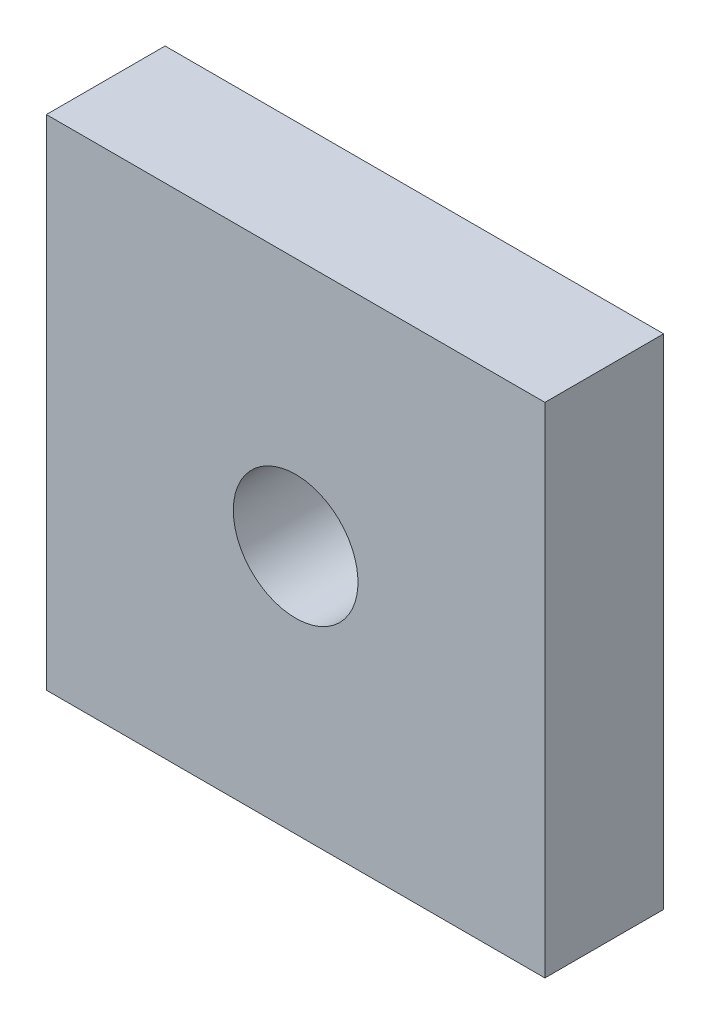
ISO-10303-21;
HEADER;
FILE_DESCRIPTION(('STEP AP214'),'2;1');
FILE_NAME('part.step','',(''),(''),'','','');
FILE_SCHEMA(('AUTOMOTIVE_DESIGN { 1 0 10303 214 1 1 1 1 }'));
ENDSEC;
DATA;
#1=APPLICATION_CONTEXT('core data for automotive mechanical design processes');
#2=APPLICATION_PROTOCOL_DEFINITION('international standard','automotive_design',2000,#1);
#3=PRODUCT_CONTEXT('',#1,'mechanical');
#4=PRODUCT('Part','Part','',(#3));
#5=PRODUCT_RELATED_PRODUCT_CATEGORY('part','',(#4));
#6=PRODUCT_DEFINITION_FORMATION('','',#4);
#7=PRODUCT_DEFINITION_CONTEXT('part definition',#1,'design');
#8=PRODUCT_DEFINITION('design','',#6,#7);
#9=PRODUCT_DEFINITION_SHAPE('','',#8);
#10=(LENGTH_UNIT() NAMED_UNIT(*) SI_UNIT(.MILLI.,.METRE.));
#11=(NAMED_UNIT(*) PLANE_ANGLE_UNIT() SI_UNIT($,.RADIAN.));
#12=(NAMED_UNIT(*) SI_UNIT($,.STERADIAN.) SOLID_ANGLE_UNIT());
#13=UNCERTAINTY_MEASURE_WITH_UNIT(LENGTH_MEASURE(1.E-05),#10,'distance_accuracy_value','');
#14=(GEOMETRIC_REPRESENTATION_CONTEXT(3) GLOBAL_UNCERTAINTY_ASSIGNED_CONTEXT((#13)) GLOBAL_UNIT_ASSIGNED_CONTEXT((#10,
#11,#12)) REPRESENTATION_CONTEXT('',''));
#15=CARTESIAN_POINT('',(0.,0.,0.));
#16=DIRECTION('',(0.,0.,1.));
#17=DIRECTION('',(1.,0.,0.));
#18=AXIS2_PLACEMENT_3D('',#15,#16,#17);
#19=CARTESIAN_POINT('',(0.,0.,4.7625));
#20=DIRECTION('',(0.,0.,-1.));
#21=DIRECTION('',(-1.,0.,0.));
#22=AXIS2_PLACEMENT_3D('',#19,#20,#21);
#23=PLANE('',#22);
#24=DIRECTION('',(0.,-1.,0.));
#25=VECTOR('',#24,1.);
#26=CARTESIAN_POINT('',(-10.,-10.,4.7625));
#27=LINE('',#26,#25);
#28=CARTESIAN_POINT('',(-10.,10.,4.7625));
#29=VERTEX_POINT('',#28);
#30=CARTESIAN_POINT('',(-10.,-10.,4.7625));
#31=VERTEX_POINT('',#30);
#32=EDGE_CURVE('E85',#29,#31,#27,.T.);
#33=ORIENTED_EDGE('',*,*,#32,.T.);
#34=DIRECTION('',(1.,0.,0.));
#35=VECTOR('',#34,1.);
#36=CARTESIAN_POINT('',(-10.,-10.,4.7625));
#37=LINE('',#36,#35);
#38=CARTESIAN_POINT('',(10.,-10.,4.7625));
#39=VERTEX_POINT('',#38);
#40=EDGE_CURVE('E80',#31,#39,#37,.T.);
#41=ORIENTED_EDGE('',*,*,#40,.T.);
#42=DIRECTION('',(0.,1.,0.));
#43=VECTOR('',#42,1.);
#44=CARTESIAN_POINT('',(10.,-10.,4.7625));
#45=LINE('',#44,#43);
#46=CARTESIAN_POINT('',(10.,10.,4.7625));
#47=VERTEX_POINT('',#46);
#48=EDGE_CURVE('E83',#39,#47,#45,.T.);
#49=ORIENTED_EDGE('',*,*,#48,.T.);
#50=DIRECTION('',(-1.,0.,0.));
#51=VECTOR('',#50,1.);
#52=CARTESIAN_POINT('',(-10.,10.,4.7625));
#53=LINE('',#52,#51);
#54=EDGE_CURVE('E50',#47,#29,#53,.T.);
#55=ORIENTED_EDGE('',*,*,#54,.T.);
#56=EDGE_LOOP('',(#33,#41,#49,#55));
#57=FACE_BOUND('',#56,.T.);
#58=CARTESIAN_POINT('',(0.,0.,4.7625));
#59=DIRECTION('',(0.,0.,1.));
#60=DIRECTION('',(1.,0.,0.));
#61=AXIS2_PLACEMENT_3D('',#58,#59,#60);
#62=CIRCLE('',#61,2.5);
#63=CARTESIAN_POINT('',(-2.5,0.,4.7625));
#64=VERTEX_POINT('',#63);
#65=EDGE_CURVE('E100',#64,#64,#62,.T.);
#66=ORIENTED_EDGE('',*,*,#65,.F.);
#67=EDGE_LOOP('',(#66));
#68=FACE_BOUND('',#67,.T.);
#69=ADVANCED_FACE('F33',(#57,#68),#23,.F.);
#70=CARTESIAN_POINT('',(0.,0.,0.));
#71=DIRECTION('',(0.,0.,-1.));
#72=DIRECTION('',(-1.,0.,0.));
#73=AXIS2_PLACEMENT_3D('',#70,#71,#72);
#74=PLANE('',#73);
#75=DIRECTION('',(0.,-1.,0.));
#76=VECTOR('',#75,1.);
#77=CARTESIAN_POINT('',(-10.,-10.,0.));
#78=LINE('',#77,#76);
#79=CARTESIAN_POINT('',(-10.,10.,0.));
#80=VERTEX_POINT('',#79);
#81=CARTESIAN_POINT('',(-10.,-10.,0.));
#82=VERTEX_POINT('',#81);
#83=EDGE_CURVE('E97',#80,#82,#78,.T.);
#84=ORIENTED_EDGE('',*,*,#83,.F.);
#85=DIRECTION('',(-1.,0.,0.));
#86=VECTOR('',#85,1.);
#87=CARTESIAN_POINT('',(-10.,10.,0.));
#88=LINE('',#87,#86);
#89=CARTESIAN_POINT('',(10.,10.,0.));
#90=VERTEX_POINT('',#89);
#91=EDGE_CURVE('E73',#90,#80,#88,.T.);
#92=ORIENTED_EDGE('',*,*,#91,.F.);
#93=DIRECTION('',(0.,1.,0.));
#94=VECTOR('',#93,1.);
#95=CARTESIAN_POINT('',(10.,-10.,0.));
#96=LINE('',#95,#94);
#97=CARTESIAN_POINT('',(10.,-10.,0.));
#98=VERTEX_POINT('',#97);
#99=EDGE_CURVE('E67',#98,#90,#96,.T.);
#100=ORIENTED_EDGE('',*,*,#99,.F.);
#101=DIRECTION('',(1.,0.,0.));
#102=VECTOR('',#101,1.);
#103=CARTESIAN_POINT('',(-10.,-10.,0.));
#104=LINE('',#103,#102);
#105=EDGE_CURVE('E89',#82,#98,#104,.T.);
#106=ORIENTED_EDGE('',*,*,#105,.F.);
#107=EDGE_LOOP('',(#84,#92,#100,#106));
#108=FACE_BOUND('',#107,.T.);
#109=CARTESIAN_POINT('',(0.,0.,0.));
#110=DIRECTION('',(0.,0.,1.));
#111=DIRECTION('',(1.,0.,0.));
#112=AXIS2_PLACEMENT_3D('',#109,#110,#111);
#113=CIRCLE('',#112,2.5);
#114=CARTESIAN_POINT('',(-2.5,0.,0.));
#115=VERTEX_POINT('',#114);
#116=EDGE_CURVE('E112',#115,#115,#113,.T.);
#117=ORIENTED_EDGE('',*,*,#116,.T.);
#118=EDGE_LOOP('',(#117));
#119=FACE_BOUND('',#118,.T.);
#120=ADVANCED_FACE('F108',(#108,#119),#74,.T.);
#121=CARTESIAN_POINT('',(-10.,-10.,4.7625));
#122=DIRECTION('',(1.,0.,0.));
#123=DIRECTION('',(0.,1.,0.));
#124=AXIS2_PLACEMENT_3D('',#121,#122,#123);
#125=PLANE('',#124);
#126=ORIENTED_EDGE('',*,*,#83,.T.);
#127=DIRECTION('',(0.,0.,-1.));
#128=VECTOR('',#127,1.);
#129=CARTESIAN_POINT('',(-10.,-10.,4.7625));
#130=LINE('',#129,#128);
#131=EDGE_CURVE('E11',#31,#82,#130,.T.);
#132=ORIENTED_EDGE('',*,*,#131,.F.);
#133=ORIENTED_EDGE('',*,*,#32,.F.);
#134=DIRECTION('',(0.,0.,-1.));
#135=VECTOR('',#134,1.);
#136=CARTESIAN_POINT('',(-10.,10.,4.7625));
#137=LINE('',#136,#135);
#138=EDGE_CURVE('E93',#29,#80,#137,.T.);
#139=ORIENTED_EDGE('',*,*,#138,.T.);
#140=EDGE_LOOP('',(#126,#132,#133,#139));
#141=FACE_BOUND('',#140,.T.);
#142=ADVANCED_FACE('F35',(#141),#125,.F.);
#143=CARTESIAN_POINT('',(-10.,-10.,4.7625));
#144=DIRECTION('',(0.,1.,0.));
#145=DIRECTION('',(0.,0.,1.));
#146=AXIS2_PLACEMENT_3D('',#143,#144,#145);
#147=PLANE('',#146);
#148=ORIENTED_EDGE('',*,*,#105,.T.);
#149=DIRECTION('',(0.,0.,-1.));
#150=VECTOR('',#149,1.);
#151=CARTESIAN_POINT('',(10.,-10.,4.7625));
#152=LINE('',#151,#150);
#153=EDGE_CURVE('E42',#39,#98,#152,.T.);
#154=ORIENTED_EDGE('',*,*,#153,.F.);
#155=ORIENTED_EDGE('',*,*,#40,.F.);
#156=ORIENTED_EDGE('',*,*,#131,.T.);
#157=EDGE_LOOP('',(#148,#154,#155,#156));
#158=FACE_BOUND('',#157,.T.);
#159=ADVANCED_FACE('F88',(#158),#147,.F.);
#160=CARTESIAN_POINT('',(10.,-10.,4.7625));
#161=DIRECTION('',(-1.,0.,0.));
#162=DIRECTION('',(0.,0.,1.));
#163=AXIS2_PLACEMENT_3D('',#160,#161,#162);
#164=PLANE('',#163);
#165=ORIENTED_EDGE('',*,*,#99,.T.);
#166=DIRECTION('',(0.,0.,-1.));
#167=VECTOR('',#166,1.);
#168=CARTESIAN_POINT('',(10.,10.,4.7625));
#169=LINE('',#168,#167);
#170=EDGE_CURVE('E90',#47,#90,#169,.T.);
#171=ORIENTED_EDGE('',*,*,#170,.F.);
#172=ORIENTED_EDGE('',*,*,#48,.F.);
#173=ORIENTED_EDGE('',*,*,#153,.T.);
#174=EDGE_LOOP('',(#165,#171,#172,#173));
#175=FACE_BOUND('',#174,.T.);
#176=ADVANCED_FACE('F91',(#175),#164,.F.);
#177=CARTESIAN_POINT('',(-10.,10.,4.7625));
#178=DIRECTION('',(0.,-1.,0.));
#179=DIRECTION('',(0.,0.,-1.));
#180=AXIS2_PLACEMENT_3D('',#177,#178,#179);
#181=PLANE('',#180);
#182=ORIENTED_EDGE('',*,*,#91,.T.);
#183=ORIENTED_EDGE('',*,*,#138,.F.);
#184=ORIENTED_EDGE('',*,*,#54,.F.);
#185=ORIENTED_EDGE('',*,*,#170,.T.);
#186=EDGE_LOOP('',(#182,#183,#184,#185));
#187=FACE_BOUND('',#186,.T.);
#188=ADVANCED_FACE('F105',(#187),#181,.F.);
#189=CARTESIAN_POINT('',(0.,0.,4.7625));
#190=DIRECTION('',(0.,0.,-1.));
#191=DIRECTION('',(-1.,0.,0.));
#192=AXIS2_PLACEMENT_3D('',#189,#190,#191);
#193=CYLINDRICAL_SURFACE('',#192,2.5);
#194=CARTESIAN_POINT('',(-2.5,0.,4.7625));
#195=CARTESIAN_POINT('',(-2.5,0.,4.712890625));
#196=CARTESIAN_POINT('',(-2.5,0.,4.66328125));
#197=CARTESIAN_POINT('',(-2.5,0.,4.5640625));
#198=CARTESIAN_POINT('',(-2.5,0.,4.514453125));
#199=CARTESIAN_POINT('',(-2.5,0.,4.415234375));
#200=CARTESIAN_POINT('',(-2.5,0.,4.365625));
#201=CARTESIAN_POINT('',(-2.5,0.,4.26640625));
#202=CARTESIAN_POINT('',(-2.5,0.,4.216796875));
#203=CARTESIAN_POINT('',(-2.5,0.,4.117578125));
#204=CARTESIAN_POINT('',(-2.5,0.,4.06796875));
#205=CARTESIAN_POINT('',(-2.5,0.,3.96875));
#206=CARTESIAN_POINT('',(-2.5,0.,3.919140625));
#207=CARTESIAN_POINT('',(-2.5,0.,3.819921875));
#208=CARTESIAN_POINT('',(-2.5,0.,3.7703125));
#209=CARTESIAN_POINT('',(-2.5,0.,3.67109375));
#210=CARTESIAN_POINT('',(-2.5,0.,3.621484375));
#211=CARTESIAN_POINT('',(-2.5,0.,3.522265625));
#212=CARTESIAN_POINT('',(-2.5,0.,3.47265625));
#213=CARTESIAN_POINT('',(-2.5,0.,3.3734375));
#214=CARTESIAN_POINT('',(-2.5,0.,3.323828125));
#215=CARTESIAN_POINT('',(-2.5,0.,3.224609375));
#216=CARTESIAN_POINT('',(-2.5,0.,3.175));
#217=CARTESIAN_POINT('',(-2.5,0.,3.07578125));
#218=CARTESIAN_POINT('',(-2.5,0.,3.026171875));
#219=CARTESIAN_POINT('',(-2.5,0.,2.926953125));
#220=CARTESIAN_POINT('',(-2.5,0.,2.87734375));
#221=CARTESIAN_POINT('',(-2.5,0.,2.778125));
#222=CARTESIAN_POINT('',(-2.5,0.,2.728515625));
#223=CARTESIAN_POINT('',(-2.5,0.,2.629296875));
#224=CARTESIAN_POINT('',(-2.5,0.,2.5796875));
#225=CARTESIAN_POINT('',(-2.5,0.,2.48046875));
#226=CARTESIAN_POINT('',(-2.5,0.,2.430859375));
#227=CARTESIAN_POINT('',(-2.5,0.,2.331640625));
#228=CARTESIAN_POINT('',(-2.5,0.,2.28203125));
#229=CARTESIAN_POINT('',(-2.5,0.,2.1828125));
#230=CARTESIAN_POINT('',(-2.5,0.,2.133203125));
#231=CARTESIAN_POINT('',(-2.5,0.,2.033984375));
#232=CARTESIAN_POINT('',(-2.5,0.,1.984375));
#233=CARTESIAN_POINT('',(-2.5,0.,1.88515625));
#234=CARTESIAN_POINT('',(-2.5,0.,1.835546875));
#235=CARTESIAN_POINT('',(-2.5,0.,1.736328125));
#236=CARTESIAN_POINT('',(-2.5,0.,1.68671875));
#237=CARTESIAN_POINT('',(-2.5,0.,1.5875));
#238=CARTESIAN_POINT('',(-2.5,0.,1.537890625));
#239=CARTESIAN_POINT('',(-2.5,0.,1.438671875));
#240=CARTESIAN_POINT('',(-2.5,0.,1.3890625));
#241=CARTESIAN_POINT('',(-2.5,0.,1.28984375));
#242=CARTESIAN_POINT('',(-2.5,0.,1.240234375));
#243=CARTESIAN_POINT('',(-2.5,0.,1.141015625));
#244=CARTESIAN_POINT('',(-2.5,0.,1.09140625));
#245=CARTESIAN_POINT('',(-2.5,0.,0.992187499999999));
#246=CARTESIAN_POINT('',(-2.5,0.,0.942578124999999));
#247=CARTESIAN_POINT('',(-2.5,0.,0.843359375));
#248=CARTESIAN_POINT('',(-2.5,0.,0.79375));
#249=CARTESIAN_POINT('',(-2.5,0.,0.69453125));
#250=CARTESIAN_POINT('',(-2.5,0.,0.644921875));
#251=CARTESIAN_POINT('',(-2.5,0.,0.545703125));
#252=CARTESIAN_POINT('',(-2.5,0.,0.49609375));
#253=CARTESIAN_POINT('',(-2.5,0.,0.396875));
#254=CARTESIAN_POINT('',(-2.5,0.,0.347265625));
#255=CARTESIAN_POINT('',(-2.5,0.,0.248046875));
#256=CARTESIAN_POINT('',(-2.5,0.,0.1984375));
#257=CARTESIAN_POINT('',(-2.5,0.,0.09921875));
#258=CARTESIAN_POINT('',(-2.5,0.,0.049609375));
#259=CARTESIAN_POINT('',(-2.5,0.,0.));
#260=B_SPLINE_CURVE_WITH_KNOTS('',3,(#194,#195,#196,#197,#198,#199,#200,#201,#202,#203,#204,
#205,#206,#207,#208,#209,#210,#211,#212,#213,#214,#215,#216,#217,#218,#219,#220,#221,#222,#223,
#224,#225,#226,#227,#228,#229,#230,#231,#232,#233,#234,#235,#236,#237,#238,#239,#240,#241,#242,
#243,#244,#245,#246,#247,#248,#249,#250,#251,#252,#253,#254,#255,#256,#257,#258,#259),
.UNSPECIFIED.,.F.,.F.,(4,2,2,2,2,2,2,2,2,2,2,2,2,2,2,2,2,2,2,2,2,2,2,2,2,2,2,2,2,2,2,2,4),(0.,
0.148828125,0.29765625,0.446484375,0.5953125,0.744140625,0.892968750000001,1.041796875,1.190625,
1.339453125,1.48828125,1.637109375,1.7859375,1.934765625,2.08359375,2.232421875,2.38125,
2.530078125,2.67890625,2.827734375,2.9765625,3.125390625,3.27421875,3.423046875,3.571875,
3.720703125,3.86953125,4.018359375,4.1671875,4.316015625,4.46484375,4.613671875,4.7625),.UNSPECIFIED.);
#261=EDGE_CURVE('BSEAM118',#64,#115,#260,.T.);
#262=ORIENTED_EDGE('',*,*,#65,.T.);
#263=ORIENTED_EDGE('',*,*,#116,.F.);
#264=ORIENTED_EDGE('',*,*,#261,.T.);
#265=ORIENTED_EDGE('',*,*,#261,.F.);
#266=EDGE_LOOP('',(#262,#264,#263,#265));
#267=FACE_BOUND('',#266,.T.);
#268=ADVANCED_FACE('F118',(#267),#193,.F.);
#269=CLOSED_SHELL('',(#69,#120,#142,#159,#176,#188,#268));
#270=MANIFOLD_SOLID_BREP('B2',#269);
#271=ADVANCED_BREP_SHAPE_REPRESENTATION('',(#18,#270),#14);
#272=SHAPE_DEFINITION_REPRESENTATION(#9,#271);
ENDSEC;
END-ISO-10303-21;
